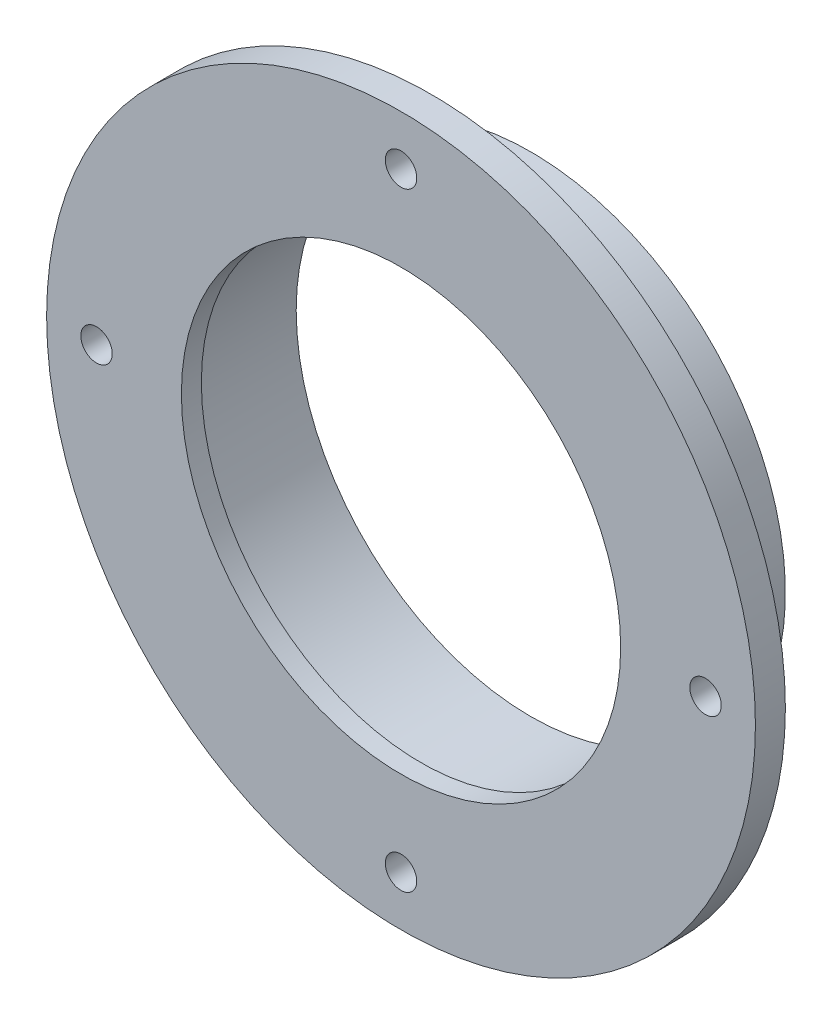
ISO-10303-21;
HEADER;
FILE_DESCRIPTION(('STEP AP214'),'2;1');
FILE_NAME('part.step','',(''),(''),'','','');
FILE_SCHEMA(('AUTOMOTIVE_DESIGN { 1 0 10303 214 1 1 1 1 }'));
ENDSEC;
DATA;
#1=APPLICATION_CONTEXT('core data for automotive mechanical design processes');
#2=APPLICATION_PROTOCOL_DEFINITION('international standard','automotive_design',2000,#1);
#3=PRODUCT_CONTEXT('',#1,'mechanical');
#4=PRODUCT('Part','Part','',(#3));
#5=PRODUCT_RELATED_PRODUCT_CATEGORY('part','',(#4));
#6=PRODUCT_DEFINITION_FORMATION('','',#4);
#7=PRODUCT_DEFINITION_CONTEXT('part definition',#1,'design');
#8=PRODUCT_DEFINITION('design','',#6,#7);
#9=PRODUCT_DEFINITION_SHAPE('','',#8);
#10=(LENGTH_UNIT() NAMED_UNIT(*) SI_UNIT(.MILLI.,.METRE.));
#11=(NAMED_UNIT(*) PLANE_ANGLE_UNIT() SI_UNIT($,.RADIAN.));
#12=(NAMED_UNIT(*) SI_UNIT($,.STERADIAN.) SOLID_ANGLE_UNIT());
#13=UNCERTAINTY_MEASURE_WITH_UNIT(LENGTH_MEASURE(1.E-05),#10,'distance_accuracy_value','');
#14=(GEOMETRIC_REPRESENTATION_CONTEXT(3) GLOBAL_UNCERTAINTY_ASSIGNED_CONTEXT((#13)) GLOBAL_UNIT_ASSIGNED_CONTEXT((#10,
#11,#12)) REPRESENTATION_CONTEXT('',''));
#15=CARTESIAN_POINT('',(0.,0.,0.));
#16=DIRECTION('',(0.,0.,1.));
#17=DIRECTION('',(1.,0.,0.));
#18=AXIS2_PLACEMENT_3D('',#15,#16,#17);
#19=CARTESIAN_POINT('',(0.,0.,13.));
#20=DIRECTION('',(0.,0.,-1.));
#21=DIRECTION('',(-1.,0.,0.));
#22=AXIS2_PLACEMENT_3D('',#19,#20,#21);
#23=CYLINDRICAL_SURFACE('',#22,25.5);
#24=CARTESIAN_POINT('',(0.,0.,0.));
#25=DIRECTION('',(0.,0.,1.));
#26=DIRECTION('',(1.,0.,0.));
#27=AXIS2_PLACEMENT_3D('',#24,#25,#26);
#28=CIRCLE('',#27,25.5);
#29=CARTESIAN_POINT('',(-25.5,0.,0.));
#30=VERTEX_POINT('',#29);
#31=EDGE_CURVE('E49',#30,#30,#28,.T.);
#32=CARTESIAN_POINT('',(0.,0.,10.));
#33=DIRECTION('',(0.,0.,1.));
#34=DIRECTION('',(1.,0.,0.));
#35=AXIS2_PLACEMENT_3D('',#32,#33,#34);
#36=CIRCLE('',#35,25.5);
#37=CARTESIAN_POINT('',(-25.5,0.,10.));
#38=VERTEX_POINT('',#37);
#39=EDGE_CURVE('E10',#38,#38,#36,.T.);
#40=CARTESIAN_POINT('',(-25.5,0.,0.));
#41=CARTESIAN_POINT('',(-25.5,0.,0.104166666666667));
#42=CARTESIAN_POINT('',(-25.5,0.,0.208333333333334));
#43=CARTESIAN_POINT('',(-25.5,0.,0.416666666666667));
#44=CARTESIAN_POINT('',(-25.5,0.,0.520833333333334));
#45=CARTESIAN_POINT('',(-25.5,0.,0.729166666666667));
#46=CARTESIAN_POINT('',(-25.5,0.,0.833333333333333));
#47=CARTESIAN_POINT('',(-25.5,0.,1.04166666666667));
#48=CARTESIAN_POINT('',(-25.5,0.,1.14583333333333));
#49=CARTESIAN_POINT('',(-25.5,0.,1.35416666666667));
#50=CARTESIAN_POINT('',(-25.5,0.,1.45833333333333));
#51=CARTESIAN_POINT('',(-25.5,0.,1.66666666666667));
#52=CARTESIAN_POINT('',(-25.5,0.,1.77083333333333));
#53=CARTESIAN_POINT('',(-25.5,0.,1.97916666666667));
#54=CARTESIAN_POINT('',(-25.5,0.,2.08333333333333));
#55=CARTESIAN_POINT('',(-25.5,0.,2.29166666666667));
#56=CARTESIAN_POINT('',(-25.5,0.,2.39583333333333));
#57=CARTESIAN_POINT('',(-25.5,0.,2.60416666666667));
#58=CARTESIAN_POINT('',(-25.5,0.,2.70833333333333));
#59=CARTESIAN_POINT('',(-25.5,0.,2.91666666666667));
#60=CARTESIAN_POINT('',(-25.5,0.,3.02083333333333));
#61=CARTESIAN_POINT('',(-25.5,0.,3.22916666666667));
#62=CARTESIAN_POINT('',(-25.5,0.,3.33333333333333));
#63=CARTESIAN_POINT('',(-25.5,0.,3.54166666666667));
#64=CARTESIAN_POINT('',(-25.5,0.,3.64583333333333));
#65=CARTESIAN_POINT('',(-25.5,0.,3.85416666666667));
#66=CARTESIAN_POINT('',(-25.5,0.,3.95833333333333));
#67=CARTESIAN_POINT('',(-25.5,0.,4.16666666666667));
#68=CARTESIAN_POINT('',(-25.5,0.,4.27083333333333));
#69=CARTESIAN_POINT('',(-25.5,0.,4.47916666666667));
#70=CARTESIAN_POINT('',(-25.5,0.,4.58333333333333));
#71=CARTESIAN_POINT('',(-25.5,0.,4.79166666666667));
#72=CARTESIAN_POINT('',(-25.5,0.,4.89583333333333));
#73=CARTESIAN_POINT('',(-25.5,0.,5.10416666666667));
#74=CARTESIAN_POINT('',(-25.5,0.,5.20833333333333));
#75=CARTESIAN_POINT('',(-25.5,0.,5.41666666666667));
#76=CARTESIAN_POINT('',(-25.5,0.,5.52083333333333));
#77=CARTESIAN_POINT('',(-25.5,0.,5.72916666666666));
#78=CARTESIAN_POINT('',(-25.5,0.,5.83333333333333));
#79=CARTESIAN_POINT('',(-25.5,0.,6.04166666666667));
#80=CARTESIAN_POINT('',(-25.5,0.,6.14583333333333));
#81=CARTESIAN_POINT('',(-25.5,0.,6.35416666666666));
#82=CARTESIAN_POINT('',(-25.5,0.,6.45833333333333));
#83=CARTESIAN_POINT('',(-25.5,0.,6.66666666666666));
#84=CARTESIAN_POINT('',(-25.5,0.,6.77083333333333));
#85=CARTESIAN_POINT('',(-25.5,0.,6.97916666666667));
#86=CARTESIAN_POINT('',(-25.5,0.,7.08333333333333));
#87=CARTESIAN_POINT('',(-25.5,0.,7.29166666666666));
#88=CARTESIAN_POINT('',(-25.5,0.,7.39583333333333));
#89=CARTESIAN_POINT('',(-25.5,0.,7.60416666666666));
#90=CARTESIAN_POINT('',(-25.5,0.,7.70833333333333));
#91=CARTESIAN_POINT('',(-25.5,0.,7.91666666666666));
#92=CARTESIAN_POINT('',(-25.5,0.,8.02083333333333));
#93=CARTESIAN_POINT('',(-25.5,0.,8.22916666666666));
#94=CARTESIAN_POINT('',(-25.5,0.,8.33333333333333));
#95=CARTESIAN_POINT('',(-25.5,0.,8.54166666666666));
#96=CARTESIAN_POINT('',(-25.5,0.,8.64583333333333));
#97=CARTESIAN_POINT('',(-25.5,0.,8.85416666666666));
#98=CARTESIAN_POINT('',(-25.5,0.,8.95833333333333));
#99=CARTESIAN_POINT('',(-25.5,0.,9.16666666666666));
#100=CARTESIAN_POINT('',(-25.5,0.,9.27083333333333));
#101=CARTESIAN_POINT('',(-25.5,0.,9.47916666666666));
#102=CARTESIAN_POINT('',(-25.5,0.,9.58333333333333));
#103=CARTESIAN_POINT('',(-25.5,0.,9.79166666666666));
#104=CARTESIAN_POINT('',(-25.5,0.,9.89583333333333));
#105=CARTESIAN_POINT('',(-25.5,0.,10.));
#106=B_SPLINE_CURVE_WITH_KNOTS('',3,(#40,#41,#42,#43,#44,#45,#46,#47,#48,#49,#50,#51,#52,#53,
#54,#55,#56,#57,#58,#59,#60,#61,#62,#63,#64,#65,#66,#67,#68,#69,#70,#71,#72,#73,#74,#75,#76,#77,
#78,#79,#80,#81,#82,#83,#84,#85,#86,#87,#88,#89,#90,#91,#92,#93,#94,#95,#96,#97,#98,#99,#100,
#101,#102,#103,#104,#105),.UNSPECIFIED.,.F.,.F.,(4,2,2,2,2,2,2,2,2,2,2,2,2,2,2,2,2,2,2,2,2,2,2,
2,2,2,2,2,2,2,2,2,4),(0.,0.3125,0.625000000000001,0.937499999999999,1.25,1.5625,1.875,2.1875,
2.5,2.8125,3.125,3.4375,3.75,4.0625,4.375,4.6875,5.,5.3125,5.625,5.9375,6.25,6.5625,6.875,
7.1875,7.5,7.8125,8.125,8.4375,8.75,9.0625,9.375,9.6875,10.),.UNSPECIFIED.);
#107=EDGE_CURVE('BSEAM41',#30,#38,#106,.T.);
#108=ORIENTED_EDGE('',*,*,#31,.T.);
#109=ORIENTED_EDGE('',*,*,#39,.F.);
#110=ORIENTED_EDGE('',*,*,#107,.T.);
#111=ORIENTED_EDGE('',*,*,#107,.F.);
#112=EDGE_LOOP('',(#108,#110,#109,#111));
#113=FACE_BOUND('',#112,.T.);
#114=ADVANCED_FACE('F41',(#113),#23,.T.);
#115=CARTESIAN_POINT('',(0.,0.,13.));
#116=DIRECTION('',(0.,0.,1.));
#117=DIRECTION('',(1.,0.,0.));
#118=AXIS2_PLACEMENT_3D('',#115,#116,#117);
#119=PLANE('',#118);
#120=CARTESIAN_POINT('',(0.,30.5,13.));
#121=DIRECTION('',(0.,0.,1.));
#122=DIRECTION('',(1.,0.,0.));
#123=AXIS2_PLACEMENT_3D('',#120,#121,#122);
#124=CIRCLE('',#123,1.57499999999999);
#125=CARTESIAN_POINT('',(1.57499999999999,30.5,13.));
#126=VERTEX_POINT('',#125);
#127=EDGE_CURVE('E64',#126,#126,#124,.T.);
#128=ORIENTED_EDGE('',*,*,#127,.F.);
#129=EDGE_LOOP('',(#128));
#130=FACE_BOUND('',#129,.T.);
#131=CARTESIAN_POINT('',(30.5,0.,13.));
#132=DIRECTION('',(0.,0.,1.));
#133=DIRECTION('',(1.,0.,0.));
#134=AXIS2_PLACEMENT_3D('',#131,#132,#133);
#135=CIRCLE('',#134,1.57499999999995);
#136=CARTESIAN_POINT('',(32.075,0.,13.));
#137=VERTEX_POINT('',#136);
#138=EDGE_CURVE('E161',#137,#137,#135,.T.);
#139=ORIENTED_EDGE('',*,*,#138,.F.);
#140=EDGE_LOOP('',(#139));
#141=FACE_BOUND('',#140,.T.);
#142=CARTESIAN_POINT('',(0.,-30.5,13.));
#143=DIRECTION('',(0.,0.,1.));
#144=DIRECTION('',(1.,0.,0.));
#145=AXIS2_PLACEMENT_3D('',#142,#143,#144);
#146=CIRCLE('',#145,1.57499999999999);
#147=CARTESIAN_POINT('',(1.57499999999999,-30.5,13.));
#148=VERTEX_POINT('',#147);
#149=EDGE_CURVE('E165',#148,#148,#146,.T.);
#150=ORIENTED_EDGE('',*,*,#149,.F.);
#151=EDGE_LOOP('',(#150));
#152=FACE_BOUND('',#151,.T.);
#153=CARTESIAN_POINT('',(-30.5,0.,13.));
#154=DIRECTION('',(0.,0.,1.));
#155=DIRECTION('',(1.,0.,0.));
#156=AXIS2_PLACEMENT_3D('',#153,#154,#155);
#157=CIRCLE('',#156,1.57499999999995);
#158=CARTESIAN_POINT('',(-28.9250000000001,0.,13.));
#159=VERTEX_POINT('',#158);
#160=EDGE_CURVE('E170',#159,#159,#157,.T.);
#161=ORIENTED_EDGE('',*,*,#160,.F.);
#162=EDGE_LOOP('',(#161));
#163=FACE_BOUND('',#162,.T.);
#164=CARTESIAN_POINT('',(0.,0.,13.));
#165=DIRECTION('',(0.,0.,1.));
#166=DIRECTION('',(1.,0.,0.));
#167=AXIS2_PLACEMENT_3D('',#164,#165,#166);
#168=CIRCLE('',#167,22.);
#169=CARTESIAN_POINT('',(22.,0.,13.));
#170=VERTEX_POINT('',#169);
#171=EDGE_CURVE('E85',#170,#170,#168,.T.);
#172=ORIENTED_EDGE('',*,*,#171,.F.);
#173=EDGE_LOOP('',(#172));
#174=FACE_BOUND('',#173,.T.);
#175=CARTESIAN_POINT('',(0.,0.,13.));
#176=DIRECTION('',(0.,0.,1.));
#177=DIRECTION('',(1.,0.,0.));
#178=AXIS2_PLACEMENT_3D('',#175,#176,#177);
#179=CIRCLE('',#178,35.5);
#180=CARTESIAN_POINT('',(35.5,0.,13.));
#181=VERTEX_POINT('',#180);
#182=EDGE_CURVE('E74',#181,#181,#179,.T.);
#183=ORIENTED_EDGE('',*,*,#182,.T.);
#184=EDGE_LOOP('',(#183));
#185=FACE_BOUND('',#184,.T.);
#186=ADVANCED_FACE('F108',(#130,#141,#152,#163,#174,#185),#119,.T.);
#187=CARTESIAN_POINT('',(0.,0.,0.));
#188=DIRECTION('',(0.,0.,1.));
#189=DIRECTION('',(1.,0.,0.));
#190=AXIS2_PLACEMENT_3D('',#187,#188,#189);
#191=PLANE('',#190);
#192=CARTESIAN_POINT('',(0.,0.,0.));
#193=DIRECTION('',(0.,0.,-1.));
#194=DIRECTION('',(-1.,0.,0.));
#195=AXIS2_PLACEMENT_3D('',#192,#193,#194);
#196=CIRCLE('',#195,23.5);
#197=CARTESIAN_POINT('',(-23.5,0.,0.));
#198=VERTEX_POINT('',#197);
#199=EDGE_CURVE('E93',#198,#198,#196,.T.);
#200=ORIENTED_EDGE('',*,*,#199,.F.);
#201=EDGE_LOOP('',(#200));
#202=FACE_BOUND('',#201,.T.);
#203=ORIENTED_EDGE('',*,*,#31,.F.);
#204=EDGE_LOOP('',(#203));
#205=FACE_BOUND('',#204,.T.);
#206=ADVANCED_FACE('F105',(#202,#205),#191,.F.);
#207=CARTESIAN_POINT('',(0.,0.,11.));
#208=DIRECTION('',(0.,0.,-1.));
#209=DIRECTION('',(-1.,0.,0.));
#210=AXIS2_PLACEMENT_3D('',#207,#208,#209);
#211=CYLINDRICAL_SURFACE('',#210,23.5);
#212=CARTESIAN_POINT('',(0.,0.,11.));
#213=DIRECTION('',(0.,0.,-1.));
#214=DIRECTION('',(-1.,0.,0.));
#215=AXIS2_PLACEMENT_3D('',#212,#213,#214);
#216=CIRCLE('',#215,23.5);
#217=CARTESIAN_POINT('',(-23.5,0.,11.));
#218=VERTEX_POINT('',#217);
#219=EDGE_CURVE('E55',#218,#218,#216,.T.);
#220=ORIENTED_EDGE('',*,*,#219,.F.);
#221=EDGE_LOOP('',(#220));
#222=FACE_BOUND('',#221,.T.);
#223=ORIENTED_EDGE('',*,*,#199,.T.);
#224=EDGE_LOOP('',(#223));
#225=FACE_BOUND('',#224,.T.);
#226=ADVANCED_FACE('F103',(#222,#225),#211,.F.);
#227=CARTESIAN_POINT('',(0.,0.,11.));
#228=DIRECTION('',(0.,0.,-1.));
#229=DIRECTION('',(-1.,0.,0.));
#230=AXIS2_PLACEMENT_3D('',#227,#228,#229);
#231=PLANE('',#230);
#232=CARTESIAN_POINT('',(0.,0.,11.));
#233=DIRECTION('',(0.,0.,1.));
#234=DIRECTION('',(1.,0.,0.));
#235=AXIS2_PLACEMENT_3D('',#232,#233,#234);
#236=CIRCLE('',#235,22.);
#237=CARTESIAN_POINT('',(22.,0.,11.));
#238=VERTEX_POINT('',#237);
#239=EDGE_CURVE('E89',#238,#238,#236,.T.);
#240=ORIENTED_EDGE('',*,*,#239,.T.);
#241=EDGE_LOOP('',(#240));
#242=FACE_BOUND('',#241,.T.);
#243=ORIENTED_EDGE('',*,*,#219,.T.);
#244=EDGE_LOOP('',(#243));
#245=FACE_BOUND('',#244,.T.);
#246=ADVANCED_FACE('F125',(#242,#245),#231,.T.);
#247=CARTESIAN_POINT('',(0.,0.,11.));
#248=DIRECTION('',(0.,0.,1.));
#249=DIRECTION('',(1.,0.,0.));
#250=AXIS2_PLACEMENT_3D('',#247,#248,#249);
#251=CYLINDRICAL_SURFACE('',#250,22.);
#252=ORIENTED_EDGE('',*,*,#239,.F.);
#253=EDGE_LOOP('',(#252));
#254=FACE_BOUND('',#253,.T.);
#255=ORIENTED_EDGE('',*,*,#171,.T.);
#256=EDGE_LOOP('',(#255));
#257=FACE_BOUND('',#256,.T.);
#258=ADVANCED_FACE('F129',(#254,#257),#251,.F.);
#259=CARTESIAN_POINT('',(0.,0.,10.));
#260=DIRECTION('',(0.,0.,1.));
#261=DIRECTION('',(1.,0.,0.));
#262=AXIS2_PLACEMENT_3D('',#259,#260,#261);
#263=CYLINDRICAL_SURFACE('',#262,35.5);
#264=CARTESIAN_POINT('',(0.,0.,10.));
#265=DIRECTION('',(0.,0.,1.));
#266=DIRECTION('',(1.,0.,0.));
#267=AXIS2_PLACEMENT_3D('',#264,#265,#266);
#268=CIRCLE('',#267,35.5);
#269=CARTESIAN_POINT('',(35.5,0.,10.));
#270=VERTEX_POINT('',#269);
#271=EDGE_CURVE('E79',#270,#270,#268,.T.);
#272=ORIENTED_EDGE('',*,*,#271,.T.);
#273=EDGE_LOOP('',(#272));
#274=FACE_BOUND('',#273,.T.);
#275=ORIENTED_EDGE('',*,*,#182,.F.);
#276=EDGE_LOOP('',(#275));
#277=FACE_BOUND('',#276,.T.);
#278=ADVANCED_FACE('F133',(#274,#277),#263,.T.);
#279=CARTESIAN_POINT('',(0.,0.,10.));
#280=DIRECTION('',(0.,0.,1.));
#281=DIRECTION('',(1.,0.,0.));
#282=AXIS2_PLACEMENT_3D('',#279,#280,#281);
#283=PLANE('',#282);
#284=CARTESIAN_POINT('',(0.,30.5,10.));
#285=DIRECTION('',(0.,0.,1.));
#286=DIRECTION('',(1.,0.,0.));
#287=AXIS2_PLACEMENT_3D('',#284,#285,#286);
#288=CIRCLE('',#287,1.57499999999999);
#289=CARTESIAN_POINT('',(1.57499999999999,30.5,10.));
#290=VERTEX_POINT('',#289);
#291=EDGE_CURVE('E44',#290,#290,#288,.T.);
#292=ORIENTED_EDGE('',*,*,#291,.T.);
#293=EDGE_LOOP('',(#292));
#294=FACE_BOUND('',#293,.T.);
#295=CARTESIAN_POINT('',(30.5,0.,10.));
#296=DIRECTION('',(0.,0.,1.));
#297=DIRECTION('',(1.,0.,0.));
#298=AXIS2_PLACEMENT_3D('',#295,#296,#297);
#299=CIRCLE('',#298,1.57499999999995);
#300=CARTESIAN_POINT('',(32.075,0.,10.));
#301=VERTEX_POINT('',#300);
#302=EDGE_CURVE('E67',#301,#301,#299,.T.);
#303=ORIENTED_EDGE('',*,*,#302,.T.);
#304=EDGE_LOOP('',(#303));
#305=FACE_BOUND('',#304,.T.);
#306=CARTESIAN_POINT('',(0.,-30.5,10.));
#307=DIRECTION('',(0.,0.,1.));
#308=DIRECTION('',(1.,0.,0.));
#309=AXIS2_PLACEMENT_3D('',#306,#307,#308);
#310=CIRCLE('',#309,1.57499999999999);
#311=CARTESIAN_POINT('',(1.57499999999999,-30.5,10.));
#312=VERTEX_POINT('',#311);
#313=EDGE_CURVE('E63',#312,#312,#310,.T.);
#314=ORIENTED_EDGE('',*,*,#313,.T.);
#315=EDGE_LOOP('',(#314));
#316=FACE_BOUND('',#315,.T.);
#317=CARTESIAN_POINT('',(-30.5,0.,10.));
#318=DIRECTION('',(0.,0.,1.));
#319=DIRECTION('',(1.,0.,0.));
#320=AXIS2_PLACEMENT_3D('',#317,#318,#319);
#321=CIRCLE('',#320,1.57499999999995);
#322=CARTESIAN_POINT('',(-28.9250000000001,0.,10.));
#323=VERTEX_POINT('',#322);
#324=EDGE_CURVE('E59',#323,#323,#321,.T.);
#325=ORIENTED_EDGE('',*,*,#324,.T.);
#326=EDGE_LOOP('',(#325));
#327=FACE_BOUND('',#326,.T.);
#328=ORIENTED_EDGE('',*,*,#39,.T.);
#329=EDGE_LOOP('',(#328));
#330=FACE_BOUND('',#329,.T.);
#331=ORIENTED_EDGE('',*,*,#271,.F.);
#332=EDGE_LOOP('',(#331));
#333=FACE_BOUND('',#332,.T.);
#334=ADVANCED_FACE('F137',(#294,#305,#316,#327,#330,#333),#283,.F.);
#335=CARTESIAN_POINT('',(-30.5,0.,0.));
#336=DIRECTION('',(0.,0.,1.));
#337=DIRECTION('',(1.,0.,0.));
#338=AXIS2_PLACEMENT_3D('',#335,#336,#337);
#339=CYLINDRICAL_SURFACE('',#338,1.57499999999995);
#340=CARTESIAN_POINT('',(-28.9250000000001,0.,13.));
#341=CARTESIAN_POINT('',(-28.9250000000001,0.,12.96875));
#342=CARTESIAN_POINT('',(-28.9250000000001,0.,12.9375));
#343=CARTESIAN_POINT('',(-28.9250000000001,0.,12.875));
#344=CARTESIAN_POINT('',(-28.9250000000001,0.,12.84375));
#345=CARTESIAN_POINT('',(-28.9250000000001,0.,12.78125));
#346=CARTESIAN_POINT('',(-28.9250000000001,0.,12.75));
#347=CARTESIAN_POINT('',(-28.9250000000001,0.,12.6875));
#348=CARTESIAN_POINT('',(-28.9250000000001,0.,12.65625));
#349=CARTESIAN_POINT('',(-28.9250000000001,0.,12.59375));
#350=CARTESIAN_POINT('',(-28.9250000000001,0.,12.5625));
#351=CARTESIAN_POINT('',(-28.9250000000001,0.,12.5));
#352=CARTESIAN_POINT('',(-28.9250000000001,0.,12.46875));
#353=CARTESIAN_POINT('',(-28.9250000000001,0.,12.40625));
#354=CARTESIAN_POINT('',(-28.9250000000001,0.,12.375));
#355=CARTESIAN_POINT('',(-28.9250000000001,0.,12.3125));
#356=CARTESIAN_POINT('',(-28.9250000000001,0.,12.28125));
#357=CARTESIAN_POINT('',(-28.9250000000001,0.,12.21875));
#358=CARTESIAN_POINT('',(-28.9250000000001,0.,12.1875));
#359=CARTESIAN_POINT('',(-28.9250000000001,0.,12.125));
#360=CARTESIAN_POINT('',(-28.9250000000001,0.,12.09375));
#361=CARTESIAN_POINT('',(-28.9250000000001,0.,12.03125));
#362=CARTESIAN_POINT('',(-28.9250000000001,0.,12.));
#363=CARTESIAN_POINT('',(-28.9250000000001,0.,11.9375));
#364=CARTESIAN_POINT('',(-28.9250000000001,0.,11.90625));
#365=CARTESIAN_POINT('',(-28.9250000000001,0.,11.84375));
#366=CARTESIAN_POINT('',(-28.9250000000001,0.,11.8125));
#367=CARTESIAN_POINT('',(-28.9250000000001,0.,11.75));
#368=CARTESIAN_POINT('',(-28.9250000000001,0.,11.71875));
#369=CARTESIAN_POINT('',(-28.9250000000001,0.,11.65625));
#370=CARTESIAN_POINT('',(-28.9250000000001,0.,11.625));
#371=CARTESIAN_POINT('',(-28.9250000000001,0.,11.5625));
#372=CARTESIAN_POINT('',(-28.9250000000001,0.,11.53125));
#373=CARTESIAN_POINT('',(-28.9250000000001,0.,11.46875));
#374=CARTESIAN_POINT('',(-28.9250000000001,0.,11.4375));
#375=CARTESIAN_POINT('',(-28.9250000000001,0.,11.375));
#376=CARTESIAN_POINT('',(-28.9250000000001,0.,11.34375));
#377=CARTESIAN_POINT('',(-28.9250000000001,0.,11.28125));
#378=CARTESIAN_POINT('',(-28.9250000000001,0.,11.25));
#379=CARTESIAN_POINT('',(-28.9250000000001,0.,11.1875));
#380=CARTESIAN_POINT('',(-28.9250000000001,0.,11.15625));
#381=CARTESIAN_POINT('',(-28.9250000000001,0.,11.09375));
#382=CARTESIAN_POINT('',(-28.9250000000001,0.,11.0625));
#383=CARTESIAN_POINT('',(-28.9250000000001,0.,11.));
#384=CARTESIAN_POINT('',(-28.9250000000001,0.,10.96875));
#385=CARTESIAN_POINT('',(-28.9250000000001,0.,10.90625));
#386=CARTESIAN_POINT('',(-28.9250000000001,0.,10.875));
#387=CARTESIAN_POINT('',(-28.9250000000001,0.,10.8125));
#388=CARTESIAN_POINT('',(-28.9250000000001,0.,10.78125));
#389=CARTESIAN_POINT('',(-28.9250000000001,0.,10.71875));
#390=CARTESIAN_POINT('',(-28.9250000000001,0.,10.6875));
#391=CARTESIAN_POINT('',(-28.9250000000001,0.,10.625));
#392=CARTESIAN_POINT('',(-28.9250000000001,0.,10.59375));
#393=CARTESIAN_POINT('',(-28.9250000000001,0.,10.53125));
#394=CARTESIAN_POINT('',(-28.9250000000001,0.,10.5));
#395=CARTESIAN_POINT('',(-28.9250000000001,0.,10.4375));
#396=CARTESIAN_POINT('',(-28.9250000000001,0.,10.40625));
#397=CARTESIAN_POINT('',(-28.9250000000001,0.,10.34375));
#398=CARTESIAN_POINT('',(-28.9250000000001,0.,10.3125));
#399=CARTESIAN_POINT('',(-28.9250000000001,0.,10.25));
#400=CARTESIAN_POINT('',(-28.9250000000001,0.,10.21875));
#401=CARTESIAN_POINT('',(-28.9250000000001,0.,10.15625));
#402=CARTESIAN_POINT('',(-28.9250000000001,0.,10.125));
#403=CARTESIAN_POINT('',(-28.9250000000001,0.,10.0625));
#404=CARTESIAN_POINT('',(-28.9250000000001,0.,10.03125));
#405=CARTESIAN_POINT('',(-28.9250000000001,0.,10.));
#406=B_SPLINE_CURVE_WITH_KNOTS('',3,(#340,#341,#342,#343,#344,#345,#346,#347,#348,#349,#350,
#351,#352,#353,#354,#355,#356,#357,#358,#359,#360,#361,#362,#363,#364,#365,#366,#367,#368,#369,
#370,#371,#372,#373,#374,#375,#376,#377,#378,#379,#380,#381,#382,#383,#384,#385,#386,#387,#388,
#389,#390,#391,#392,#393,#394,#395,#396,#397,#398,#399,#400,#401,#402,#403,#404,#405),
.UNSPECIFIED.,.F.,.F.,(4,2,2,2,2,2,2,2,2,2,2,2,2,2,2,2,2,2,2,2,2,2,2,2,2,2,2,2,2,2,2,2,4),(0.,
0.0937500000000001,0.1875,0.28125,0.375,0.46875,0.5625,0.656250000000001,0.750000000000001,
0.843750000000001,0.937500000000001,1.03125,1.125,1.21875,1.3125,1.40625,1.5,1.59375,1.6875,
1.78125,1.875,1.96875,2.0625,2.15625,2.25,2.34375,2.4375,2.53125,2.625,2.71875,2.8125,2.90625,
3.),.UNSPECIFIED.);
#407=EDGE_CURVE('BSEAM141',#159,#323,#406,.T.);
#408=ORIENTED_EDGE('',*,*,#160,.T.);
#409=ORIENTED_EDGE('',*,*,#324,.F.);
#410=ORIENTED_EDGE('',*,*,#407,.T.);
#411=ORIENTED_EDGE('',*,*,#407,.F.);
#412=EDGE_LOOP('',(#408,#410,#409,#411));
#413=FACE_BOUND('',#412,.T.);
#414=ADVANCED_FACE('F141',(#413),#339,.F.);
#415=CARTESIAN_POINT('',(0.,-30.5,0.));
#416=DIRECTION('',(0.,0.,1.));
#417=DIRECTION('',(1.,0.,0.));
#418=AXIS2_PLACEMENT_3D('',#415,#416,#417);
#419=CYLINDRICAL_SURFACE('',#418,1.57499999999999);
#420=CARTESIAN_POINT('',(1.57499999999999,-30.5,13.));
#421=CARTESIAN_POINT('',(1.57499999999999,-30.5,12.96875));
#422=CARTESIAN_POINT('',(1.57499999999999,-30.5,12.9375));
#423=CARTESIAN_POINT('',(1.57499999999999,-30.5,12.875));
#424=CARTESIAN_POINT('',(1.57499999999999,-30.5,12.84375));
#425=CARTESIAN_POINT('',(1.57499999999999,-30.5,12.78125));
#426=CARTESIAN_POINT('',(1.57499999999999,-30.5,12.75));
#427=CARTESIAN_POINT('',(1.57499999999999,-30.5,12.6875));
#428=CARTESIAN_POINT('',(1.57499999999999,-30.5,12.65625));
#429=CARTESIAN_POINT('',(1.57499999999999,-30.5,12.59375));
#430=CARTESIAN_POINT('',(1.57499999999999,-30.5,12.5625));
#431=CARTESIAN_POINT('',(1.57499999999999,-30.5,12.5));
#432=CARTESIAN_POINT('',(1.57499999999999,-30.5,12.46875));
#433=CARTESIAN_POINT('',(1.57499999999999,-30.5,12.40625));
#434=CARTESIAN_POINT('',(1.57499999999999,-30.5,12.375));
#435=CARTESIAN_POINT('',(1.57499999999999,-30.5,12.3125));
#436=CARTESIAN_POINT('',(1.57499999999999,-30.5,12.28125));
#437=CARTESIAN_POINT('',(1.57499999999999,-30.5,12.21875));
#438=CARTESIAN_POINT('',(1.57499999999999,-30.5,12.1875));
#439=CARTESIAN_POINT('',(1.57499999999999,-30.5,12.125));
#440=CARTESIAN_POINT('',(1.57499999999999,-30.5,12.09375));
#441=CARTESIAN_POINT('',(1.57499999999999,-30.5,12.03125));
#442=CARTESIAN_POINT('',(1.57499999999999,-30.5,12.));
#443=CARTESIAN_POINT('',(1.57499999999999,-30.5,11.9375));
#444=CARTESIAN_POINT('',(1.57499999999999,-30.5,11.90625));
#445=CARTESIAN_POINT('',(1.57499999999999,-30.5,11.84375));
#446=CARTESIAN_POINT('',(1.57499999999999,-30.5,11.8125));
#447=CARTESIAN_POINT('',(1.57499999999999,-30.5,11.75));
#448=CARTESIAN_POINT('',(1.57499999999999,-30.5,11.71875));
#449=CARTESIAN_POINT('',(1.57499999999999,-30.5,11.65625));
#450=CARTESIAN_POINT('',(1.57499999999999,-30.5,11.625));
#451=CARTESIAN_POINT('',(1.57499999999999,-30.5,11.5625));
#452=CARTESIAN_POINT('',(1.57499999999999,-30.5,11.53125));
#453=CARTESIAN_POINT('',(1.57499999999999,-30.5,11.46875));
#454=CARTESIAN_POINT('',(1.57499999999999,-30.5,11.4375));
#455=CARTESIAN_POINT('',(1.57499999999999,-30.5,11.375));
#456=CARTESIAN_POINT('',(1.57499999999999,-30.5,11.34375));
#457=CARTESIAN_POINT('',(1.57499999999999,-30.5,11.28125));
#458=CARTESIAN_POINT('',(1.57499999999999,-30.5,11.25));
#459=CARTESIAN_POINT('',(1.57499999999999,-30.5,11.1875));
#460=CARTESIAN_POINT('',(1.57499999999999,-30.5,11.15625));
#461=CARTESIAN_POINT('',(1.57499999999999,-30.5,11.09375));
#462=CARTESIAN_POINT('',(1.57499999999999,-30.5,11.0625));
#463=CARTESIAN_POINT('',(1.57499999999999,-30.5,11.));
#464=CARTESIAN_POINT('',(1.57499999999999,-30.5,10.96875));
#465=CARTESIAN_POINT('',(1.57499999999999,-30.5,10.90625));
#466=CARTESIAN_POINT('',(1.57499999999999,-30.5,10.875));
#467=CARTESIAN_POINT('',(1.57499999999999,-30.5,10.8125));
#468=CARTESIAN_POINT('',(1.57499999999999,-30.5,10.78125));
#469=CARTESIAN_POINT('',(1.57499999999999,-30.5,10.71875));
#470=CARTESIAN_POINT('',(1.57499999999999,-30.5,10.6875));
#471=CARTESIAN_POINT('',(1.57499999999999,-30.5,10.625));
#472=CARTESIAN_POINT('',(1.57499999999999,-30.5,10.59375));
#473=CARTESIAN_POINT('',(1.57499999999999,-30.5,10.53125));
#474=CARTESIAN_POINT('',(1.57499999999999,-30.5,10.5));
#475=CARTESIAN_POINT('',(1.57499999999999,-30.5,10.4375));
#476=CARTESIAN_POINT('',(1.57499999999999,-30.5,10.40625));
#477=CARTESIAN_POINT('',(1.57499999999999,-30.5,10.34375));
#478=CARTESIAN_POINT('',(1.57499999999999,-30.5,10.3125));
#479=CARTESIAN_POINT('',(1.57499999999999,-30.5,10.25));
#480=CARTESIAN_POINT('',(1.57499999999999,-30.5,10.21875));
#481=CARTESIAN_POINT('',(1.57499999999999,-30.5,10.15625));
#482=CARTESIAN_POINT('',(1.57499999999999,-30.5,10.125));
#483=CARTESIAN_POINT('',(1.57499999999999,-30.5,10.0625));
#484=CARTESIAN_POINT('',(1.57499999999999,-30.5,10.03125));
#485=CARTESIAN_POINT('',(1.57499999999999,-30.5,10.));
#486=B_SPLINE_CURVE_WITH_KNOTS('',3,(#420,#421,#422,#423,#424,#425,#426,#427,#428,#429,#430,
#431,#432,#433,#434,#435,#436,#437,#438,#439,#440,#441,#442,#443,#444,#445,#446,#447,#448,#449,
#450,#451,#452,#453,#454,#455,#456,#457,#458,#459,#460,#461,#462,#463,#464,#465,#466,#467,#468,
#469,#470,#471,#472,#473,#474,#475,#476,#477,#478,#479,#480,#481,#482,#483,#484,#485),
.UNSPECIFIED.,.F.,.F.,(4,2,2,2,2,2,2,2,2,2,2,2,2,2,2,2,2,2,2,2,2,2,2,2,2,2,2,2,2,2,2,2,4),(0.,
0.0937500000000001,0.1875,0.28125,0.375,0.46875,0.5625,0.656250000000001,0.750000000000001,
0.843750000000001,0.937500000000001,1.03125,1.125,1.21875,1.3125,1.40625,1.5,1.59375,1.6875,
1.78125,1.875,1.96875,2.0625,2.15625,2.25,2.34375,2.4375,2.53125,2.625,2.71875,2.8125,2.90625,
3.),.UNSPECIFIED.);
#487=EDGE_CURVE('BSEAM144',#148,#312,#486,.T.);
#488=ORIENTED_EDGE('',*,*,#149,.T.);
#489=ORIENTED_EDGE('',*,*,#313,.F.);
#490=ORIENTED_EDGE('',*,*,#487,.T.);
#491=ORIENTED_EDGE('',*,*,#487,.F.);
#492=EDGE_LOOP('',(#488,#490,#489,#491));
#493=FACE_BOUND('',#492,.T.);
#494=ADVANCED_FACE('F144',(#493),#419,.F.);
#495=CARTESIAN_POINT('',(30.5,0.,0.));
#496=DIRECTION('',(0.,0.,1.));
#497=DIRECTION('',(1.,0.,0.));
#498=AXIS2_PLACEMENT_3D('',#495,#496,#497);
#499=CYLINDRICAL_SURFACE('',#498,1.57499999999995);
#500=CARTESIAN_POINT('',(32.075,0.,13.));
#501=CARTESIAN_POINT('',(32.075,0.,12.96875));
#502=CARTESIAN_POINT('',(32.075,0.,12.9375));
#503=CARTESIAN_POINT('',(32.075,0.,12.875));
#504=CARTESIAN_POINT('',(32.075,0.,12.84375));
#505=CARTESIAN_POINT('',(32.075,0.,12.78125));
#506=CARTESIAN_POINT('',(32.075,0.,12.75));
#507=CARTESIAN_POINT('',(32.075,0.,12.6875));
#508=CARTESIAN_POINT('',(32.075,0.,12.65625));
#509=CARTESIAN_POINT('',(32.075,0.,12.59375));
#510=CARTESIAN_POINT('',(32.075,0.,12.5625));
#511=CARTESIAN_POINT('',(32.075,0.,12.5));
#512=CARTESIAN_POINT('',(32.075,0.,12.46875));
#513=CARTESIAN_POINT('',(32.075,0.,12.40625));
#514=CARTESIAN_POINT('',(32.075,0.,12.375));
#515=CARTESIAN_POINT('',(32.075,0.,12.3125));
#516=CARTESIAN_POINT('',(32.075,0.,12.28125));
#517=CARTESIAN_POINT('',(32.075,0.,12.21875));
#518=CARTESIAN_POINT('',(32.075,0.,12.1875));
#519=CARTESIAN_POINT('',(32.075,0.,12.125));
#520=CARTESIAN_POINT('',(32.075,0.,12.09375));
#521=CARTESIAN_POINT('',(32.075,0.,12.03125));
#522=CARTESIAN_POINT('',(32.075,0.,12.));
#523=CARTESIAN_POINT('',(32.075,0.,11.9375));
#524=CARTESIAN_POINT('',(32.075,0.,11.90625));
#525=CARTESIAN_POINT('',(32.075,0.,11.84375));
#526=CARTESIAN_POINT('',(32.075,0.,11.8125));
#527=CARTESIAN_POINT('',(32.075,0.,11.75));
#528=CARTESIAN_POINT('',(32.075,0.,11.71875));
#529=CARTESIAN_POINT('',(32.075,0.,11.65625));
#530=CARTESIAN_POINT('',(32.075,0.,11.625));
#531=CARTESIAN_POINT('',(32.075,0.,11.5625));
#532=CARTESIAN_POINT('',(32.075,0.,11.53125));
#533=CARTESIAN_POINT('',(32.075,0.,11.46875));
#534=CARTESIAN_POINT('',(32.075,0.,11.4375));
#535=CARTESIAN_POINT('',(32.075,0.,11.375));
#536=CARTESIAN_POINT('',(32.075,0.,11.34375));
#537=CARTESIAN_POINT('',(32.075,0.,11.28125));
#538=CARTESIAN_POINT('',(32.075,0.,11.25));
#539=CARTESIAN_POINT('',(32.075,0.,11.1875));
#540=CARTESIAN_POINT('',(32.075,0.,11.15625));
#541=CARTESIAN_POINT('',(32.075,0.,11.09375));
#542=CARTESIAN_POINT('',(32.075,0.,11.0625));
#543=CARTESIAN_POINT('',(32.075,0.,11.));
#544=CARTESIAN_POINT('',(32.075,0.,10.96875));
#545=CARTESIAN_POINT('',(32.075,0.,10.90625));
#546=CARTESIAN_POINT('',(32.075,0.,10.875));
#547=CARTESIAN_POINT('',(32.075,0.,10.8125));
#548=CARTESIAN_POINT('',(32.075,0.,10.78125));
#549=CARTESIAN_POINT('',(32.075,0.,10.71875));
#550=CARTESIAN_POINT('',(32.075,0.,10.6875));
#551=CARTESIAN_POINT('',(32.075,0.,10.625));
#552=CARTESIAN_POINT('',(32.075,0.,10.59375));
#553=CARTESIAN_POINT('',(32.075,0.,10.53125));
#554=CARTESIAN_POINT('',(32.075,0.,10.5));
#555=CARTESIAN_POINT('',(32.075,0.,10.4375));
#556=CARTESIAN_POINT('',(32.075,0.,10.40625));
#557=CARTESIAN_POINT('',(32.075,0.,10.34375));
#558=CARTESIAN_POINT('',(32.075,0.,10.3125));
#559=CARTESIAN_POINT('',(32.075,0.,10.25));
#560=CARTESIAN_POINT('',(32.075,0.,10.21875));
#561=CARTESIAN_POINT('',(32.075,0.,10.15625));
#562=CARTESIAN_POINT('',(32.075,0.,10.125));
#563=CARTESIAN_POINT('',(32.075,0.,10.0625));
#564=CARTESIAN_POINT('',(32.075,0.,10.03125));
#565=CARTESIAN_POINT('',(32.075,0.,10.));
#566=B_SPLINE_CURVE_WITH_KNOTS('',3,(#500,#501,#502,#503,#504,#505,#506,#507,#508,#509,#510,
#511,#512,#513,#514,#515,#516,#517,#518,#519,#520,#521,#522,#523,#524,#525,#526,#527,#528,#529,
#530,#531,#532,#533,#534,#535,#536,#537,#538,#539,#540,#541,#542,#543,#544,#545,#546,#547,#548,
#549,#550,#551,#552,#553,#554,#555,#556,#557,#558,#559,#560,#561,#562,#563,#564,#565),
.UNSPECIFIED.,.F.,.F.,(4,2,2,2,2,2,2,2,2,2,2,2,2,2,2,2,2,2,2,2,2,2,2,2,2,2,2,2,2,2,2,2,4),(0.,
0.0937500000000001,0.1875,0.28125,0.375,0.46875,0.5625,0.656250000000001,0.750000000000001,
0.843750000000001,0.937500000000001,1.03125,1.125,1.21875,1.3125,1.40625,1.5,1.59375,1.6875,
1.78125,1.875,1.96875,2.0625,2.15625,2.25,2.34375,2.4375,2.53125,2.625,2.71875,2.8125,2.90625,
3.),.UNSPECIFIED.);
#567=EDGE_CURVE('BSEAM148',#137,#301,#566,.T.);
#568=ORIENTED_EDGE('',*,*,#138,.T.);
#569=ORIENTED_EDGE('',*,*,#302,.F.);
#570=ORIENTED_EDGE('',*,*,#567,.T.);
#571=ORIENTED_EDGE('',*,*,#567,.F.);
#572=EDGE_LOOP('',(#568,#570,#569,#571));
#573=FACE_BOUND('',#572,.T.);
#574=ADVANCED_FACE('F148',(#573),#499,.F.);
#575=CARTESIAN_POINT('',(0.,30.5,0.));
#576=DIRECTION('',(0.,0.,1.));
#577=DIRECTION('',(1.,0.,0.));
#578=AXIS2_PLACEMENT_3D('',#575,#576,#577);
#579=CYLINDRICAL_SURFACE('',#578,1.57499999999999);
#580=CARTESIAN_POINT('',(1.57499999999999,30.5,13.));
#581=CARTESIAN_POINT('',(1.57499999999999,30.5,12.96875));
#582=CARTESIAN_POINT('',(1.57499999999999,30.5,12.9375));
#583=CARTESIAN_POINT('',(1.57499999999999,30.5,12.875));
#584=CARTESIAN_POINT('',(1.57499999999999,30.5,12.84375));
#585=CARTESIAN_POINT('',(1.57499999999999,30.5,12.78125));
#586=CARTESIAN_POINT('',(1.57499999999999,30.5,12.75));
#587=CARTESIAN_POINT('',(1.57499999999999,30.5,12.6875));
#588=CARTESIAN_POINT('',(1.57499999999999,30.5,12.65625));
#589=CARTESIAN_POINT('',(1.57499999999999,30.5,12.59375));
#590=CARTESIAN_POINT('',(1.57499999999999,30.5,12.5625));
#591=CARTESIAN_POINT('',(1.57499999999999,30.5,12.5));
#592=CARTESIAN_POINT('',(1.57499999999999,30.5,12.46875));
#593=CARTESIAN_POINT('',(1.57499999999999,30.5,12.40625));
#594=CARTESIAN_POINT('',(1.57499999999999,30.5,12.375));
#595=CARTESIAN_POINT('',(1.57499999999999,30.5,12.3125));
#596=CARTESIAN_POINT('',(1.57499999999999,30.5,12.28125));
#597=CARTESIAN_POINT('',(1.57499999999999,30.5,12.21875));
#598=CARTESIAN_POINT('',(1.57499999999999,30.5,12.1875));
#599=CARTESIAN_POINT('',(1.57499999999999,30.5,12.125));
#600=CARTESIAN_POINT('',(1.57499999999999,30.5,12.09375));
#601=CARTESIAN_POINT('',(1.57499999999999,30.5,12.03125));
#602=CARTESIAN_POINT('',(1.57499999999999,30.5,12.));
#603=CARTESIAN_POINT('',(1.57499999999999,30.5,11.9375));
#604=CARTESIAN_POINT('',(1.57499999999999,30.5,11.90625));
#605=CARTESIAN_POINT('',(1.57499999999999,30.5,11.84375));
#606=CARTESIAN_POINT('',(1.57499999999999,30.5,11.8125));
#607=CARTESIAN_POINT('',(1.57499999999999,30.5,11.75));
#608=CARTESIAN_POINT('',(1.57499999999999,30.5,11.71875));
#609=CARTESIAN_POINT('',(1.57499999999999,30.5,11.65625));
#610=CARTESIAN_POINT('',(1.57499999999999,30.5,11.625));
#611=CARTESIAN_POINT('',(1.57499999999999,30.5,11.5625));
#612=CARTESIAN_POINT('',(1.57499999999999,30.5,11.53125));
#613=CARTESIAN_POINT('',(1.57499999999999,30.5,11.46875));
#614=CARTESIAN_POINT('',(1.57499999999999,30.5,11.4375));
#615=CARTESIAN_POINT('',(1.57499999999999,30.5,11.375));
#616=CARTESIAN_POINT('',(1.57499999999999,30.5,11.34375));
#617=CARTESIAN_POINT('',(1.57499999999999,30.5,11.28125));
#618=CARTESIAN_POINT('',(1.57499999999999,30.5,11.25));
#619=CARTESIAN_POINT('',(1.57499999999999,30.5,11.1875));
#620=CARTESIAN_POINT('',(1.57499999999999,30.5,11.15625));
#621=CARTESIAN_POINT('',(1.57499999999999,30.5,11.09375));
#622=CARTESIAN_POINT('',(1.57499999999999,30.5,11.0625));
#623=CARTESIAN_POINT('',(1.57499999999999,30.5,11.));
#624=CARTESIAN_POINT('',(1.57499999999999,30.5,10.96875));
#625=CARTESIAN_POINT('',(1.57499999999999,30.5,10.90625));
#626=CARTESIAN_POINT('',(1.57499999999999,30.5,10.875));
#627=CARTESIAN_POINT('',(1.57499999999999,30.5,10.8125));
#628=CARTESIAN_POINT('',(1.57499999999999,30.5,10.78125));
#629=CARTESIAN_POINT('',(1.57499999999999,30.5,10.71875));
#630=CARTESIAN_POINT('',(1.57499999999999,30.5,10.6875));
#631=CARTESIAN_POINT('',(1.57499999999999,30.5,10.625));
#632=CARTESIAN_POINT('',(1.57499999999999,30.5,10.59375));
#633=CARTESIAN_POINT('',(1.57499999999999,30.5,10.53125));
#634=CARTESIAN_POINT('',(1.57499999999999,30.5,10.5));
#635=CARTESIAN_POINT('',(1.57499999999999,30.5,10.4375));
#636=CARTESIAN_POINT('',(1.57499999999999,30.5,10.40625));
#637=CARTESIAN_POINT('',(1.57499999999999,30.5,10.34375));
#638=CARTESIAN_POINT('',(1.57499999999999,30.5,10.3125));
#639=CARTESIAN_POINT('',(1.57499999999999,30.5,10.25));
#640=CARTESIAN_POINT('',(1.57499999999999,30.5,10.21875));
#641=CARTESIAN_POINT('',(1.57499999999999,30.5,10.15625));
#642=CARTESIAN_POINT('',(1.57499999999999,30.5,10.125));
#643=CARTESIAN_POINT('',(1.57499999999999,30.5,10.0625));
#644=CARTESIAN_POINT('',(1.57499999999999,30.5,10.03125));
#645=CARTESIAN_POINT('',(1.57499999999999,30.5,10.));
#646=B_SPLINE_CURVE_WITH_KNOTS('',3,(#580,#581,#582,#583,#584,#585,#586,#587,#588,#589,#590,
#591,#592,#593,#594,#595,#596,#597,#598,#599,#600,#601,#602,#603,#604,#605,#606,#607,#608,#609,
#610,#611,#612,#613,#614,#615,#616,#617,#618,#619,#620,#621,#622,#623,#624,#625,#626,#627,#628,
#629,#630,#631,#632,#633,#634,#635,#636,#637,#638,#639,#640,#641,#642,#643,#644,#645),
.UNSPECIFIED.,.F.,.F.,(4,2,2,2,2,2,2,2,2,2,2,2,2,2,2,2,2,2,2,2,2,2,2,2,2,2,2,2,2,2,2,2,4),(0.,
0.0937500000000001,0.1875,0.28125,0.375,0.46875,0.5625,0.656250000000001,0.750000000000001,
0.843750000000001,0.937500000000001,1.03125,1.125,1.21875,1.3125,1.40625,1.5,1.59375,1.6875,
1.78125,1.875,1.96875,2.0625,2.15625,2.25,2.34375,2.4375,2.53125,2.625,2.71875,2.8125,2.90625,
3.),.UNSPECIFIED.);
#647=EDGE_CURVE('BSEAM152',#126,#290,#646,.T.);
#648=ORIENTED_EDGE('',*,*,#127,.T.);
#649=ORIENTED_EDGE('',*,*,#291,.F.);
#650=ORIENTED_EDGE('',*,*,#647,.T.);
#651=ORIENTED_EDGE('',*,*,#647,.F.);
#652=EDGE_LOOP('',(#648,#650,#649,#651));
#653=FACE_BOUND('',#652,.T.);
#654=ADVANCED_FACE('F152',(#653),#579,.F.);
#655=CLOSED_SHELL('',(#114,#186,#206,#226,#246,#258,#278,#334,#414,#494,#574,#654));
#656=MANIFOLD_SOLID_BREP('B2',#655);
#657=ADVANCED_BREP_SHAPE_REPRESENTATION('',(#18,#656),#14);
#658=SHAPE_DEFINITION_REPRESENTATION(#9,#657);
ENDSEC;
END-ISO-10303-21;
